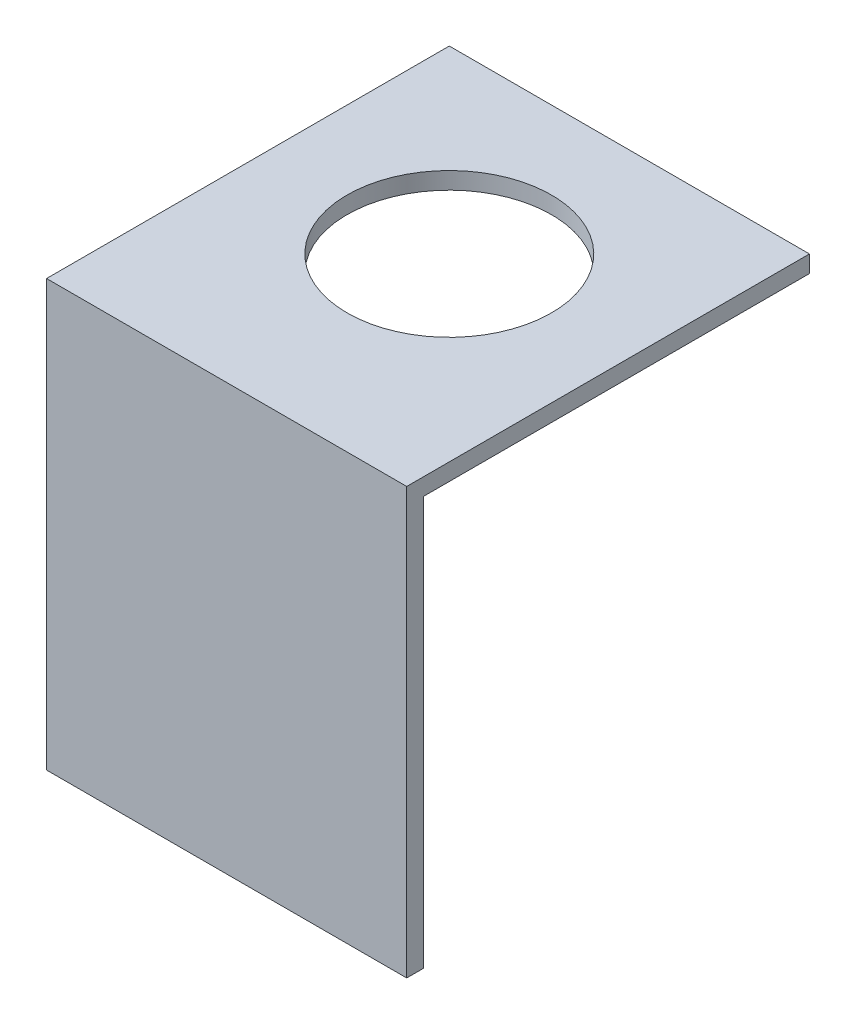
ISO-10303-21;
HEADER;
FILE_DESCRIPTION(('STEP AP214'),'2;1');
FILE_NAME('part.step','',(''),(''),'','','');
FILE_SCHEMA(('AUTOMOTIVE_DESIGN { 1 0 10303 214 1 1 1 1 }'));
ENDSEC;
DATA;
#1=APPLICATION_CONTEXT('core data for automotive mechanical design processes');
#2=APPLICATION_PROTOCOL_DEFINITION('international standard','automotive_design',2000,#1);
#3=PRODUCT_CONTEXT('',#1,'mechanical');
#4=PRODUCT('Part','Part','',(#3));
#5=PRODUCT_RELATED_PRODUCT_CATEGORY('part','',(#4));
#6=PRODUCT_DEFINITION_FORMATION('','',#4);
#7=PRODUCT_DEFINITION_CONTEXT('part definition',#1,'design');
#8=PRODUCT_DEFINITION('design','',#6,#7);
#9=PRODUCT_DEFINITION_SHAPE('','',#8);
#10=(LENGTH_UNIT() NAMED_UNIT(*) SI_UNIT(.MILLI.,.METRE.));
#11=(NAMED_UNIT(*) PLANE_ANGLE_UNIT() SI_UNIT($,.RADIAN.));
#12=(NAMED_UNIT(*) SI_UNIT($,.STERADIAN.) SOLID_ANGLE_UNIT());
#13=UNCERTAINTY_MEASURE_WITH_UNIT(LENGTH_MEASURE(1.E-05),#10,'distance_accuracy_value','');
#14=(GEOMETRIC_REPRESENTATION_CONTEXT(3) GLOBAL_UNCERTAINTY_ASSIGNED_CONTEXT((#13)) GLOBAL_UNIT_ASSIGNED_CONTEXT((#10,
#11,#12)) REPRESENTATION_CONTEXT('',''));
#15=CARTESIAN_POINT('',(0.,0.,0.));
#16=DIRECTION('',(0.,0.,1.));
#17=DIRECTION('',(1.,0.,0.));
#18=AXIS2_PLACEMENT_3D('',#15,#16,#17);
#19=CARTESIAN_POINT('',(0.,14.1337718310282,0.));
#20=DIRECTION('',(0.,-1.,0.));
#21=DIRECTION('',(0.,0.,-1.));
#22=AXIS2_PLACEMENT_3D('',#19,#20,#21);
#23=PLANE('',#22);
#24=DIRECTION('',(0.,0.,-1.));
#25=VECTOR('',#24,1.);
#26=CARTESIAN_POINT('',(18.3742345061645,14.1337718310282,26.15));
#27=LINE('',#26,#25);
#28=CARTESIAN_POINT('',(18.3742345061645,14.1337718310282,26.15));
#29=VERTEX_POINT('',#28);
#30=CARTESIAN_POINT('',(18.3742345061645,14.1337718310282,-21.15));
#31=VERTEX_POINT('',#30);
#32=EDGE_CURVE('E133',#29,#31,#27,.T.);
#33=ORIENTED_EDGE('',*,*,#32,.T.);
#34=DIRECTION('',(-1.,0.,0.));
#35=VECTOR('',#34,1.);
#36=CARTESIAN_POINT('',(-23.9257654938355,14.1337718310282,-21.15));
#37=LINE('',#36,#35);
#38=CARTESIAN_POINT('',(-23.9257654938355,14.1337718310282,-21.15));
#39=VERTEX_POINT('',#38);
#40=EDGE_CURVE('E80',#31,#39,#37,.T.);
#41=ORIENTED_EDGE('',*,*,#40,.T.);
#42=DIRECTION('',(0.,0.,1.));
#43=VECTOR('',#42,1.);
#44=CARTESIAN_POINT('',(-23.9257654938355,14.1337718310282,26.15));
#45=LINE('',#44,#43);
#46=CARTESIAN_POINT('',(-23.9257654938355,14.1337718310282,26.15));
#47=VERTEX_POINT('',#46);
#48=EDGE_CURVE('E136',#39,#47,#45,.T.);
#49=ORIENTED_EDGE('',*,*,#48,.T.);
#50=DIRECTION('',(1.,0.,0.));
#51=VECTOR('',#50,1.);
#52=CARTESIAN_POINT('',(-23.9257654938355,14.1337718310282,26.15));
#53=LINE('',#52,#51);
#54=EDGE_CURVE('E60',#47,#29,#53,.T.);
#55=ORIENTED_EDGE('',*,*,#54,.T.);
#56=EDGE_LOOP('',(#33,#41,#49,#55));
#57=FACE_BOUND('',#56,.T.);
#58=CARTESIAN_POINT('',(-2.7757654938355,14.1337718310282,0.));
#59=DIRECTION('',(0.,1.,0.));
#60=DIRECTION('',(0.,0.,1.));
#61=AXIS2_PLACEMENT_3D('',#58,#59,#60);
#62=CIRCLE('',#61,12.);
#63=CARTESIAN_POINT('',(-2.7757654938355,14.1337718310282,12.));
#64=VERTEX_POINT('',#63);
#65=EDGE_CURVE('E123',#64,#64,#62,.T.);
#66=ORIENTED_EDGE('',*,*,#65,.F.);
#67=EDGE_LOOP('',(#66));
#68=FACE_BOUND('',#67,.T.);
#69=ADVANCED_FACE('F36',(#57,#68),#23,.F.);
#70=CARTESIAN_POINT('',(0.,12.1337718310282,0.));
#71=DIRECTION('',(0.,-1.,0.));
#72=DIRECTION('',(0.,0.,-1.));
#73=AXIS2_PLACEMENT_3D('',#70,#71,#72);
#74=PLANE('',#73);
#75=DIRECTION('',(1.,0.,0.));
#76=VECTOR('',#75,1.);
#77=CARTESIAN_POINT('',(-23.9257654938355,12.1337718310282,24.15));
#78=LINE('',#77,#76);
#79=CARTESIAN_POINT('',(-23.9257654938355,12.1337718310282,24.15));
#80=VERTEX_POINT('',#79);
#81=CARTESIAN_POINT('',(18.3742345061645,12.1337718310282,24.15));
#82=VERTEX_POINT('',#81);
#83=EDGE_CURVE('E51',#80,#82,#78,.T.);
#84=ORIENTED_EDGE('',*,*,#83,.F.);
#85=DIRECTION('',(0.,0.,1.));
#86=VECTOR('',#85,1.);
#87=CARTESIAN_POINT('',(-23.9257654938355,12.1337718310282,26.15));
#88=LINE('',#87,#86);
#89=CARTESIAN_POINT('',(-23.9257654938355,12.1337718310282,-21.15));
#90=VERTEX_POINT('',#89);
#91=EDGE_CURVE('E104',#90,#80,#88,.T.);
#92=ORIENTED_EDGE('',*,*,#91,.F.);
#93=DIRECTION('',(-1.,0.,0.));
#94=VECTOR('',#93,1.);
#95=CARTESIAN_POINT('',(-23.9257654938355,12.1337718310282,-21.15));
#96=LINE('',#95,#94);
#97=CARTESIAN_POINT('',(18.3742345061645,12.1337718310282,-21.15));
#98=VERTEX_POINT('',#97);
#99=EDGE_CURVE('E75',#98,#90,#96,.T.);
#100=ORIENTED_EDGE('',*,*,#99,.F.);
#101=DIRECTION('',(0.,0.,-1.));
#102=VECTOR('',#101,1.);
#103=CARTESIAN_POINT('',(18.3742345061645,12.1337718310282,26.15));
#104=LINE('',#103,#102);
#105=EDGE_CURVE('E131',#82,#98,#104,.T.);
#106=ORIENTED_EDGE('',*,*,#105,.F.);
#107=EDGE_LOOP('',(#84,#92,#100,#106));
#108=FACE_BOUND('',#107,.T.);
#109=CARTESIAN_POINT('',(-2.7757654938355,12.1337718310282,0.));
#110=DIRECTION('',(0.,1.,0.));
#111=DIRECTION('',(0.,0.,1.));
#112=AXIS2_PLACEMENT_3D('',#109,#110,#111);
#113=CIRCLE('',#112,12.);
#114=CARTESIAN_POINT('',(-2.7757654938355,12.1337718310282,12.));
#115=VERTEX_POINT('',#114);
#116=EDGE_CURVE('E120',#115,#115,#113,.T.);
#117=ORIENTED_EDGE('',*,*,#116,.T.);
#118=EDGE_LOOP('',(#117));
#119=FACE_BOUND('',#118,.T.);
#120=ADVANCED_FACE('F146',(#108,#119),#74,.T.);
#121=CARTESIAN_POINT('',(18.3742345061645,14.1337718310282,26.15));
#122=DIRECTION('',(-1.,0.,0.));
#123=DIRECTION('',(0.,0.,1.));
#124=AXIS2_PLACEMENT_3D('',#121,#122,#123);
#125=PLANE('',#124);
#126=DIRECTION('',(0.,-1.,0.));
#127=VECTOR('',#126,1.);
#128=CARTESIAN_POINT('',(18.3742345061645,14.1337718310282,26.15));
#129=LINE('',#128,#127);
#130=CARTESIAN_POINT('',(18.3742345061645,-35.8662281689718,26.15));
#131=VERTEX_POINT('',#130);
#132=EDGE_CURVE('E139',#29,#131,#129,.T.);
#133=ORIENTED_EDGE('',*,*,#132,.T.);
#134=DIRECTION('',(0.,0.,1.));
#135=VECTOR('',#134,1.);
#136=CARTESIAN_POINT('',(18.3742345061645,-35.8662281689718,24.15));
#137=LINE('',#136,#135);
#138=CARTESIAN_POINT('',(18.3742345061645,-35.8662281689718,24.15));
#139=VERTEX_POINT('',#138);
#140=EDGE_CURVE('E115',#139,#131,#137,.T.);
#141=ORIENTED_EDGE('',*,*,#140,.F.);
#142=DIRECTION('',(0.,1.,0.));
#143=VECTOR('',#142,1.);
#144=CARTESIAN_POINT('',(18.3742345061645,-78.2134830977154,24.15));
#145=LINE('',#144,#143);
#146=EDGE_CURVE('E106',#139,#82,#145,.T.);
#147=ORIENTED_EDGE('',*,*,#146,.T.);
#148=ORIENTED_EDGE('',*,*,#105,.T.);
#149=DIRECTION('',(0.,-1.,0.));
#150=VECTOR('',#149,1.);
#151=CARTESIAN_POINT('',(18.3742345061645,14.1337718310282,-21.15));
#152=LINE('',#151,#150);
#153=EDGE_CURVE('E11',#31,#98,#152,.T.);
#154=ORIENTED_EDGE('',*,*,#153,.F.);
#155=ORIENTED_EDGE('',*,*,#32,.F.);
#156=EDGE_LOOP('',(#133,#141,#147,#148,#154,#155));
#157=FACE_BOUND('',#156,.T.);
#158=ADVANCED_FACE('F38',(#157),#125,.F.);
#159=CARTESIAN_POINT('',(-23.9257654938355,14.1337718310282,-21.15));
#160=DIRECTION('',(0.,0.,1.));
#161=DIRECTION('',(1.,0.,0.));
#162=AXIS2_PLACEMENT_3D('',#159,#160,#161);
#163=PLANE('',#162);
#164=ORIENTED_EDGE('',*,*,#99,.T.);
#165=DIRECTION('',(0.,-1.,0.));
#166=VECTOR('',#165,1.);
#167=CARTESIAN_POINT('',(-23.9257654938355,14.1337718310282,-21.15));
#168=LINE('',#167,#166);
#169=EDGE_CURVE('E44',#39,#90,#168,.T.);
#170=ORIENTED_EDGE('',*,*,#169,.F.);
#171=ORIENTED_EDGE('',*,*,#40,.F.);
#172=ORIENTED_EDGE('',*,*,#153,.T.);
#173=EDGE_LOOP('',(#164,#170,#171,#172));
#174=FACE_BOUND('',#173,.T.);
#175=ADVANCED_FACE('F149',(#174),#163,.F.);
#176=CARTESIAN_POINT('',(-23.9257654938355,14.1337718310282,26.15));
#177=DIRECTION('',(1.,0.,0.));
#178=DIRECTION('',(0.,0.,-1.));
#179=AXIS2_PLACEMENT_3D('',#176,#177,#178);
#180=PLANE('',#179);
#181=ORIENTED_EDGE('',*,*,#91,.T.);
#182=DIRECTION('',(0.,1.,0.));
#183=VECTOR('',#182,1.);
#184=CARTESIAN_POINT('',(-23.9257654938355,-78.2134830977154,24.15));
#185=LINE('',#184,#183);
#186=CARTESIAN_POINT('',(-23.9257654938355,-35.8662281689718,24.15));
#187=VERTEX_POINT('',#186);
#188=EDGE_CURVE('E97',#187,#80,#185,.T.);
#189=ORIENTED_EDGE('',*,*,#188,.F.);
#190=DIRECTION('',(0.,0.,-1.));
#191=VECTOR('',#190,1.);
#192=CARTESIAN_POINT('',(-23.9257654938355,-35.8662281689718,24.15));
#193=LINE('',#192,#191);
#194=CARTESIAN_POINT('',(-23.9257654938355,-35.8662281689718,26.15));
#195=VERTEX_POINT('',#194);
#196=EDGE_CURVE('E102',#195,#187,#193,.T.);
#197=ORIENTED_EDGE('',*,*,#196,.F.);
#198=DIRECTION('',(0.,-1.,0.));
#199=VECTOR('',#198,1.);
#200=CARTESIAN_POINT('',(-23.9257654938355,14.1337718310282,26.15));
#201=LINE('',#200,#199);
#202=EDGE_CURVE('E144',#47,#195,#201,.T.);
#203=ORIENTED_EDGE('',*,*,#202,.F.);
#204=ORIENTED_EDGE('',*,*,#48,.F.);
#205=ORIENTED_EDGE('',*,*,#169,.T.);
#206=EDGE_LOOP('',(#181,#189,#197,#203,#204,#205));
#207=FACE_BOUND('',#206,.T.);
#208=ADVANCED_FACE('F99',(#207),#180,.F.);
#209=CARTESIAN_POINT('',(-23.9257654938355,14.1337718310282,26.15));
#210=DIRECTION('',(0.,0.,-1.));
#211=DIRECTION('',(-1.,0.,0.));
#212=AXIS2_PLACEMENT_3D('',#209,#210,#211);
#213=PLANE('',#212);
#214=ORIENTED_EDGE('',*,*,#202,.T.);
#215=DIRECTION('',(-1.,0.,0.));
#216=VECTOR('',#215,1.);
#217=CARTESIAN_POINT('',(-23.9257654938355,-35.8662281689718,26.15));
#218=LINE('',#217,#216);
#219=EDGE_CURVE('E119',#131,#195,#218,.T.);
#220=ORIENTED_EDGE('',*,*,#219,.F.);
#221=ORIENTED_EDGE('',*,*,#132,.F.);
#222=ORIENTED_EDGE('',*,*,#54,.F.);
#223=EDGE_LOOP('',(#214,#220,#221,#222));
#224=FACE_BOUND('',#223,.T.);
#225=ADVANCED_FACE('F153',(#224),#213,.F.);
#226=CARTESIAN_POINT('',(-2.7757654938355,14.1337718310282,0.));
#227=DIRECTION('',(0.,-1.,0.));
#228=DIRECTION('',(0.,0.,-1.));
#229=AXIS2_PLACEMENT_3D('',#226,#227,#228);
#230=CYLINDRICAL_SURFACE('',#229,12.);
#231=ORIENTED_EDGE('',*,*,#65,.T.);
#232=EDGE_LOOP('',(#231));
#233=FACE_BOUND('',#232,.T.);
#234=ORIENTED_EDGE('',*,*,#116,.F.);
#235=EDGE_LOOP('',(#234));
#236=FACE_BOUND('',#235,.T.);
#237=ADVANCED_FACE('F155',(#233,#236),#230,.F.);
#238=CARTESIAN_POINT('',(-23.9257654938355,-78.2134830977154,24.15));
#239=DIRECTION('',(0.,0.,1.));
#240=DIRECTION('',(1.,0.,0.));
#241=AXIS2_PLACEMENT_3D('',#238,#239,#240);
#242=PLANE('',#241);
#243=DIRECTION('',(1.,0.,0.));
#244=VECTOR('',#243,1.);
#245=CARTESIAN_POINT('',(-23.9257654938355,-35.8662281689718,24.15));
#246=LINE('',#245,#244);
#247=EDGE_CURVE('E109',#187,#139,#246,.T.);
#248=ORIENTED_EDGE('',*,*,#247,.F.);
#249=ORIENTED_EDGE('',*,*,#188,.T.);
#250=ORIENTED_EDGE('',*,*,#83,.T.);
#251=ORIENTED_EDGE('',*,*,#146,.F.);
#252=EDGE_LOOP('',(#248,#249,#250,#251));
#253=FACE_BOUND('',#252,.T.);
#254=ADVANCED_FACE('F110',(#253),#242,.F.);
#255=CARTESIAN_POINT('',(-2.7757654938355,-35.8662281689718,-43.45));
#256=DIRECTION('',(0.,-1.,0.));
#257=DIRECTION('',(0.,0.,-1.));
#258=AXIS2_PLACEMENT_3D('',#255,#256,#257);
#259=PLANE('',#258);
#260=ORIENTED_EDGE('',*,*,#247,.T.);
#261=ORIENTED_EDGE('',*,*,#140,.T.);
#262=ORIENTED_EDGE('',*,*,#219,.T.);
#263=ORIENTED_EDGE('',*,*,#196,.T.);
#264=EDGE_LOOP('',(#260,#261,#262,#263));
#265=FACE_BOUND('',#264,.T.);
#266=ADVANCED_FACE('F117',(#265),#259,.T.);
#267=CLOSED_SHELL('',(#69,#120,#158,#175,#208,#225,#237,#254,#266));
#268=MANIFOLD_SOLID_BREP('B2',#267);
#269=ADVANCED_BREP_SHAPE_REPRESENTATION('',(#18,#268),#14);
#270=SHAPE_DEFINITION_REPRESENTATION(#9,#269);
ENDSEC;
END-ISO-10303-21;
